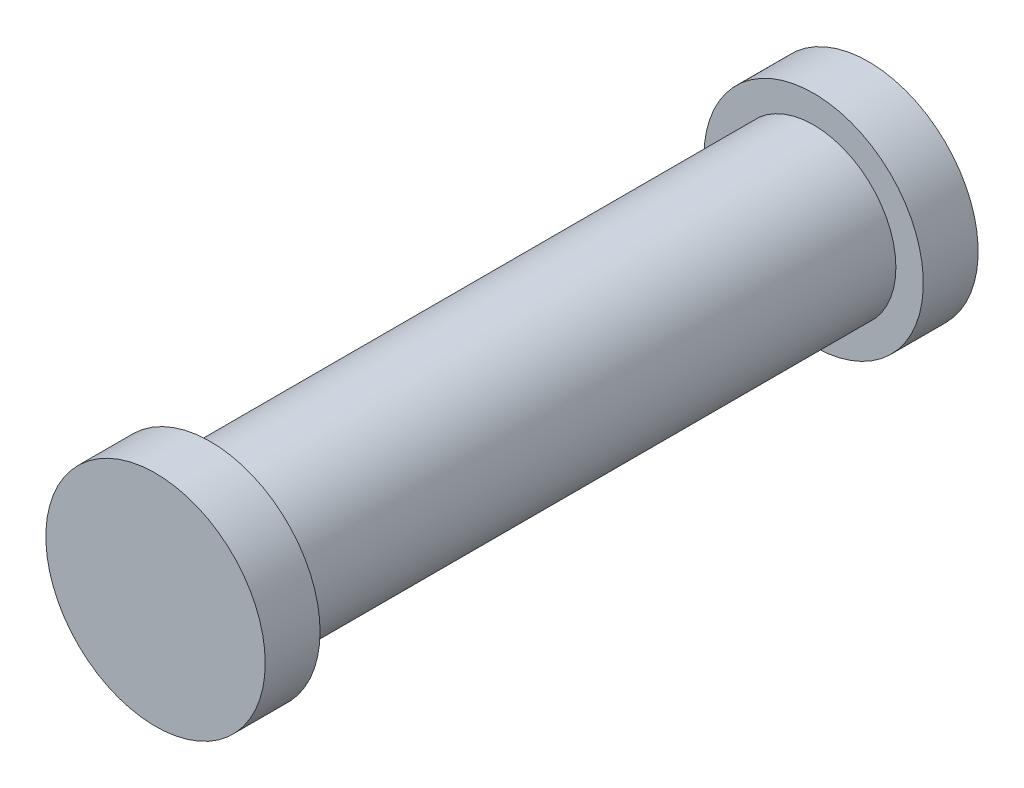
ISO-10303-21;
HEADER;
FILE_DESCRIPTION(('STEP AP214'),'2;1');
FILE_NAME('part.step','',(''),(''),'','','');
FILE_SCHEMA(('AUTOMOTIVE_DESIGN { 1 0 10303 214 1 1 1 1 }'));
ENDSEC;
DATA;
#1=APPLICATION_CONTEXT('core data for automotive mechanical design processes');
#2=APPLICATION_PROTOCOL_DEFINITION('international standard','automotive_design',2000,#1);
#3=PRODUCT_CONTEXT('',#1,'mechanical');
#4=PRODUCT('Part','Part','',(#3));
#5=PRODUCT_RELATED_PRODUCT_CATEGORY('part','',(#4));
#6=PRODUCT_DEFINITION_FORMATION('','',#4);
#7=PRODUCT_DEFINITION_CONTEXT('part definition',#1,'design');
#8=PRODUCT_DEFINITION('design','',#6,#7);
#9=PRODUCT_DEFINITION_SHAPE('','',#8);
#10=(LENGTH_UNIT() NAMED_UNIT(*) SI_UNIT(.MILLI.,.METRE.));
#11=(NAMED_UNIT(*) PLANE_ANGLE_UNIT() SI_UNIT($,.RADIAN.));
#12=(NAMED_UNIT(*) SI_UNIT($,.STERADIAN.) SOLID_ANGLE_UNIT());
#13=UNCERTAINTY_MEASURE_WITH_UNIT(LENGTH_MEASURE(1.E-05),#10,'distance_accuracy_value','');
#14=(GEOMETRIC_REPRESENTATION_CONTEXT(3) GLOBAL_UNCERTAINTY_ASSIGNED_CONTEXT((#13)) GLOBAL_UNIT_ASSIGNED_CONTEXT((#10,
#11,#12)) REPRESENTATION_CONTEXT('',''));
#15=CARTESIAN_POINT('',(0.,0.,0.));
#16=DIRECTION('',(0.,0.,1.));
#17=DIRECTION('',(1.,0.,0.));
#18=AXIS2_PLACEMENT_3D('',#15,#16,#17);
#19=CARTESIAN_POINT('',(0.,0.,75.9));
#20=DIRECTION('',(0.,0.,-1.));
#21=DIRECTION('',(-1.,0.,0.));
#22=AXIS2_PLACEMENT_3D('',#19,#20,#21);
#23=CYLINDRICAL_SURFACE('',#22,10.35);
#24=CARTESIAN_POINT('',(0.,0.,75.9));
#25=DIRECTION('',(0.,0.,1.));
#26=DIRECTION('',(1.,0.,0.));
#27=AXIS2_PLACEMENT_3D('',#24,#25,#26);
#28=CIRCLE('',#27,10.35);
#29=CARTESIAN_POINT('',(10.35,0.,75.9));
#30=VERTEX_POINT('',#29);
#31=EDGE_CURVE('E10',#30,#30,#28,.T.);
#32=ORIENTED_EDGE('',*,*,#31,.F.);
#33=EDGE_LOOP('',(#32));
#34=FACE_BOUND('',#33,.T.);
#35=CARTESIAN_POINT('',(0.,0.,0.));
#36=DIRECTION('',(0.,0.,-1.));
#37=DIRECTION('',(-1.,0.,0.));
#38=AXIS2_PLACEMENT_3D('',#35,#36,#37);
#39=CIRCLE('',#38,10.35);
#40=CARTESIAN_POINT('',(-10.35,0.,0.));
#41=VERTEX_POINT('',#40);
#42=EDGE_CURVE('E46',#41,#41,#39,.T.);
#43=ORIENTED_EDGE('',*,*,#42,.F.);
#44=EDGE_LOOP('',(#43));
#45=FACE_BOUND('',#44,.T.);
#46=ADVANCED_FACE('F31',(#34,#45),#23,.T.);
#47=CARTESIAN_POINT('',(0.,0.,75.9));
#48=DIRECTION('',(0.,0.,1.));
#49=DIRECTION('',(1.,0.,0.));
#50=AXIS2_PLACEMENT_3D('',#47,#48,#49);
#51=PLANE('',#50);
#52=CARTESIAN_POINT('',(0.,0.,75.9));
#53=DIRECTION('',(0.,0.,1.));
#54=DIRECTION('',(1.,0.,0.));
#55=AXIS2_PLACEMENT_3D('',#52,#53,#54);
#56=CIRCLE('',#55,13.8);
#57=CARTESIAN_POINT('',(13.8,0.,75.9));
#58=VERTEX_POINT('',#57);
#59=EDGE_CURVE('E41',#58,#58,#56,.T.);
#60=ORIENTED_EDGE('',*,*,#59,.F.);
#61=EDGE_LOOP('',(#60));
#62=FACE_BOUND('',#61,.T.);
#63=ORIENTED_EDGE('',*,*,#31,.T.);
#64=EDGE_LOOP('',(#63));
#65=FACE_BOUND('',#64,.T.);
#66=ADVANCED_FACE('F73',(#62,#65),#51,.F.);
#67=CARTESIAN_POINT('',(0.,0.,82.8));
#68=DIRECTION('',(0.,0.,-1.));
#69=DIRECTION('',(-1.,0.,0.));
#70=AXIS2_PLACEMENT_3D('',#67,#68,#69);
#71=CYLINDRICAL_SURFACE('',#70,13.8);
#72=CARTESIAN_POINT('',(0.,0.,82.8));
#73=DIRECTION('',(0.,0.,1.));
#74=DIRECTION('',(1.,0.,0.));
#75=AXIS2_PLACEMENT_3D('',#72,#73,#74);
#76=CIRCLE('',#75,13.8);
#77=CARTESIAN_POINT('',(13.8,0.,82.8));
#78=VERTEX_POINT('',#77);
#79=EDGE_CURVE('E37',#78,#78,#76,.T.);
#80=ORIENTED_EDGE('',*,*,#79,.F.);
#81=EDGE_LOOP('',(#80));
#82=FACE_BOUND('',#81,.T.);
#83=ORIENTED_EDGE('',*,*,#59,.T.);
#84=EDGE_LOOP('',(#83));
#85=FACE_BOUND('',#84,.T.);
#86=ADVANCED_FACE('F78',(#82,#85),#71,.T.);
#87=CARTESIAN_POINT('',(0.,0.,82.8));
#88=DIRECTION('',(0.,0.,1.));
#89=DIRECTION('',(1.,0.,0.));
#90=AXIS2_PLACEMENT_3D('',#87,#88,#89);
#91=PLANE('',#90);
#92=ORIENTED_EDGE('',*,*,#79,.T.);
#93=EDGE_LOOP('',(#92));
#94=FACE_BOUND('',#93,.T.);
#95=ADVANCED_FACE('F68',(#94),#91,.T.);
#96=CARTESIAN_POINT('',(0.,0.,0.));
#97=DIRECTION('',(0.,0.,-1.));
#98=DIRECTION('',(-1.,0.,0.));
#99=AXIS2_PLACEMENT_3D('',#96,#97,#98);
#100=PLANE('',#99);
#101=CARTESIAN_POINT('',(0.,0.,0.));
#102=DIRECTION('',(0.,0.,-1.));
#103=DIRECTION('',(-1.,0.,0.));
#104=AXIS2_PLACEMENT_3D('',#101,#102,#103);
#105=CIRCLE('',#104,13.8);
#106=CARTESIAN_POINT('',(-13.8,0.,0.));
#107=VERTEX_POINT('',#106);
#108=EDGE_CURVE('E51',#107,#107,#105,.T.);
#109=ORIENTED_EDGE('',*,*,#108,.F.);
#110=EDGE_LOOP('',(#109));
#111=FACE_BOUND('',#110,.T.);
#112=ORIENTED_EDGE('',*,*,#42,.T.);
#113=EDGE_LOOP('',(#112));
#114=FACE_BOUND('',#113,.T.);
#115=ADVANCED_FACE('F62',(#111,#114),#100,.F.);
#116=CARTESIAN_POINT('',(0.,0.,-6.9));
#117=DIRECTION('',(0.,0.,1.));
#118=DIRECTION('',(1.,0.,0.));
#119=AXIS2_PLACEMENT_3D('',#116,#117,#118);
#120=CYLINDRICAL_SURFACE('',#119,13.8);
#121=CARTESIAN_POINT('',(0.,0.,-6.9));
#122=DIRECTION('',(0.,0.,-1.));
#123=DIRECTION('',(-1.,0.,0.));
#124=AXIS2_PLACEMENT_3D('',#121,#122,#123);
#125=CIRCLE('',#124,13.8);
#126=CARTESIAN_POINT('',(-13.8,0.,-6.9));
#127=VERTEX_POINT('',#126);
#128=EDGE_CURVE('E50',#127,#127,#125,.T.);
#129=ORIENTED_EDGE('',*,*,#128,.F.);
#130=EDGE_LOOP('',(#129));
#131=FACE_BOUND('',#130,.T.);
#132=ORIENTED_EDGE('',*,*,#108,.T.);
#133=EDGE_LOOP('',(#132));
#134=FACE_BOUND('',#133,.T.);
#135=ADVANCED_FACE('F59',(#131,#134),#120,.T.);
#136=CARTESIAN_POINT('',(0.,0.,-6.9));
#137=DIRECTION('',(0.,0.,-1.));
#138=DIRECTION('',(-1.,0.,0.));
#139=AXIS2_PLACEMENT_3D('',#136,#137,#138);
#140=PLANE('',#139);
#141=ORIENTED_EDGE('',*,*,#128,.T.);
#142=EDGE_LOOP('',(#141));
#143=FACE_BOUND('',#142,.T.);
#144=ADVANCED_FACE('F57',(#143),#140,.T.);
#145=CLOSED_SHELL('',(#46,#66,#86,#95,#115,#135,#144));
#146=MANIFOLD_SOLID_BREP('B2',#145);
#147=ADVANCED_BREP_SHAPE_REPRESENTATION('',(#18,#146),#14);
#148=SHAPE_DEFINITION_REPRESENTATION(#9,#147);
ENDSEC;
END-ISO-10303-21;
